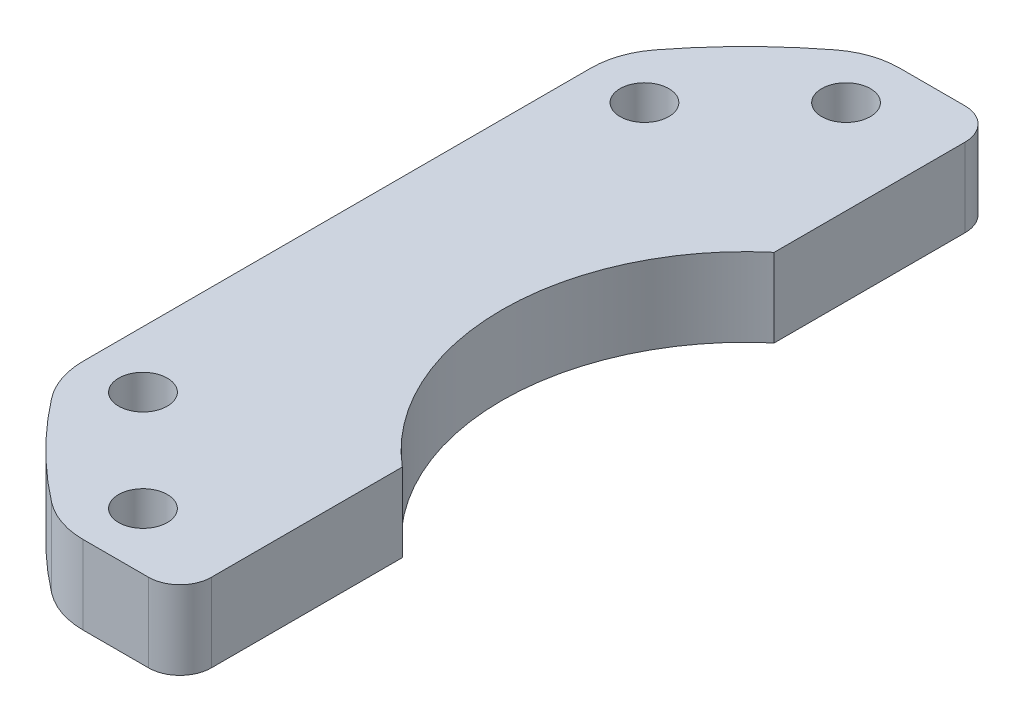
ISO-10303-21;
HEADER;
FILE_DESCRIPTION(('STEP AP214'),'2;1');
FILE_NAME('part.step','',(''),(''),'','','');
FILE_SCHEMA(('AUTOMOTIVE_DESIGN { 1 0 10303 214 1 1 1 1 }'));
ENDSEC;
DATA;
#1=APPLICATION_CONTEXT('core data for automotive mechanical design processes');
#2=APPLICATION_PROTOCOL_DEFINITION('international standard','automotive_design',2000,#1);
#3=PRODUCT_CONTEXT('',#1,'mechanical');
#4=PRODUCT('Part','Part','',(#3));
#5=PRODUCT_RELATED_PRODUCT_CATEGORY('part','',(#4));
#6=PRODUCT_DEFINITION_FORMATION('','',#4);
#7=PRODUCT_DEFINITION_CONTEXT('part definition',#1,'design');
#8=PRODUCT_DEFINITION('design','',#6,#7);
#9=PRODUCT_DEFINITION_SHAPE('','',#8);
#10=(LENGTH_UNIT() NAMED_UNIT(*) SI_UNIT(.MILLI.,.METRE.));
#11=(NAMED_UNIT(*) PLANE_ANGLE_UNIT() SI_UNIT($,.RADIAN.));
#12=(NAMED_UNIT(*) SI_UNIT($,.STERADIAN.) SOLID_ANGLE_UNIT());
#13=UNCERTAINTY_MEASURE_WITH_UNIT(LENGTH_MEASURE(1.E-05),#10,'distance_accuracy_value','');
#14=(GEOMETRIC_REPRESENTATION_CONTEXT(3) GLOBAL_UNCERTAINTY_ASSIGNED_CONTEXT((#13)) GLOBAL_UNIT_ASSIGNED_CONTEXT((#10,
#11,#12)) REPRESENTATION_CONTEXT('',''));
#15=CARTESIAN_POINT('',(0.,0.,0.));
#16=DIRECTION('',(0.,0.,1.));
#17=DIRECTION('',(1.,0.,0.));
#18=AXIS2_PLACEMENT_3D('',#15,#16,#17);
#19=CARTESIAN_POINT('',(0.,5.,0.));
#20=DIRECTION('',(0.,1.,0.));
#21=DIRECTION('',(0.,0.,1.));
#22=AXIS2_PLACEMENT_3D('',#19,#20,#21);
#23=PLANE('',#22);
#24=CARTESIAN_POINT('',(0.,5.,0.));
#25=DIRECTION('',(0.,1.,0.));
#26=DIRECTION('',(0.,0.,1.));
#27=AXIS2_PLACEMENT_3D('',#24,#25,#26);
#28=CIRCLE('',#27,31.5);
#29=CARTESIAN_POINT('',(-24.9622641509436,5.,19.2128958894415));
#30=VERTEX_POINT('',#29);
#31=CARTESIAN_POINT('',(-19.2128958894419,5.,24.9622641509433));
#32=VERTEX_POINT('',#31);
#33=EDGE_CURVE('E186',#30,#32,#28,.T.);
#34=ORIENTED_EDGE('',*,*,#33,.T.);
#35=CARTESIAN_POINT('',(-16.1632298752448,5.,20.9999999999999));
#36=DIRECTION('',(0.,1.,0.));
#37=DIRECTION('',(0.,0.,1.));
#38=AXIS2_PLACEMENT_3D('',#35,#36,#37);
#39=CIRCLE('',#38,5.);
#40=CARTESIAN_POINT('',(-16.1632298752448,5.,25.9999999999999));
#41=VERTEX_POINT('',#40);
#42=EDGE_CURVE('E240',#32,#41,#39,.T.);
#43=ORIENTED_EDGE('',*,*,#42,.T.);
#44=DIRECTION('',(1.,0.,0.));
#45=VECTOR('',#44,1.);
#46=CARTESIAN_POINT('',(17.7834192437786,5.,26.0000000000001));
#47=LINE('',#46,#45);
#48=CARTESIAN_POINT('',(-12.,5.,25.9999999999999));
#49=VERTEX_POINT('',#48);
#50=EDGE_CURVE('E188',#41,#49,#47,.T.);
#51=ORIENTED_EDGE('',*,*,#50,.T.);
#52=CARTESIAN_POINT('',(-12.,5.,23.9999999999999));
#53=DIRECTION('',(0.,1.,0.));
#54=DIRECTION('',(0.,0.,1.));
#55=AXIS2_PLACEMENT_3D('',#52,#53,#54);
#56=CIRCLE('',#55,2.);
#57=CARTESIAN_POINT('',(-9.99999999999999,5.,23.9999999999999));
#58=VERTEX_POINT('',#57);
#59=EDGE_CURVE('E163',#49,#58,#56,.T.);
#60=ORIENTED_EDGE('',*,*,#59,.T.);
#61=DIRECTION('',(0.,0.,1.));
#62=VECTOR('',#61,1.);
#63=CARTESIAN_POINT('',(-10.,5.,-41.4188248679399));
#64=LINE('',#63,#62);
#65=CARTESIAN_POINT('',(-9.99999999999999,5.,11.842719282327));
#66=VERTEX_POINT('',#65);
#67=EDGE_CURVE('E146',#66,#58,#64,.T.);
#68=ORIENTED_EDGE('',*,*,#67,.F.);
#69=CARTESIAN_POINT('',(0.,5.,0.));
#70=DIRECTION('',(0.,1.,0.));
#71=DIRECTION('',(0.,0.,1.));
#72=AXIS2_PLACEMENT_3D('',#69,#70,#71);
#73=CIRCLE('',#72,15.5);
#74=CARTESIAN_POINT('',(-9.99999999999999,5.,-11.842719282327));
#75=VERTEX_POINT('',#74);
#76=EDGE_CURVE('E161',#75,#66,#73,.T.);
#77=ORIENTED_EDGE('',*,*,#76,.F.);
#78=CARTESIAN_POINT('',(-10.,5.,-24.));
#79=VERTEX_POINT('',#78);
#80=EDGE_CURVE('E164',#79,#75,#64,.T.);
#81=ORIENTED_EDGE('',*,*,#80,.F.);
#82=CARTESIAN_POINT('',(-12.,5.,-24.));
#83=DIRECTION('',(0.,1.,0.));
#84=DIRECTION('',(0.,0.,1.));
#85=AXIS2_PLACEMENT_3D('',#82,#83,#84);
#86=CIRCLE('',#85,2.);
#87=CARTESIAN_POINT('',(-12.,5.,-26.));
#88=VERTEX_POINT('',#87);
#89=EDGE_CURVE('E204',#79,#88,#86,.T.);
#90=ORIENTED_EDGE('',*,*,#89,.T.);
#91=DIRECTION('',(-1.,0.,0.));
#92=VECTOR('',#91,1.);
#93=CARTESIAN_POINT('',(-17.7834192437787,5.,-26.));
#94=LINE('',#93,#92);
#95=CARTESIAN_POINT('',(-16.1632298752446,5.,-26.));
#96=VERTEX_POINT('',#95);
#97=EDGE_CURVE('E155',#88,#96,#94,.T.);
#98=ORIENTED_EDGE('',*,*,#97,.T.);
#99=CARTESIAN_POINT('',(-16.1632298752446,5.,-21.));
#100=DIRECTION('',(0.,1.,0.));
#101=DIRECTION('',(0.,0.,1.));
#102=AXIS2_PLACEMENT_3D('',#99,#100,#101);
#103=CIRCLE('',#102,5.);
#104=CARTESIAN_POINT('',(-19.2128958894417,5.,-24.9622641509434));
#105=VERTEX_POINT('',#104);
#106=EDGE_CURVE('E235',#96,#105,#103,.T.);
#107=ORIENTED_EDGE('',*,*,#106,.T.);
#108=CARTESIAN_POINT('',(0.,5.,0.));
#109=DIRECTION('',(0.,1.,0.));
#110=DIRECTION('',(0.,0.,1.));
#111=AXIS2_PLACEMENT_3D('',#108,#109,#110);
#112=CIRCLE('',#111,31.5);
#113=CARTESIAN_POINT('',(-24.9622641509432,5.,-19.212895889442));
#114=VERTEX_POINT('',#113);
#115=EDGE_CURVE('E181',#105,#114,#112,.T.);
#116=ORIENTED_EDGE('',*,*,#115,.T.);
#117=CARTESIAN_POINT('',(-20.9999999999998,5.,-16.1632298752448));
#118=DIRECTION('',(0.,1.,0.));
#119=DIRECTION('',(0.,0.,1.));
#120=AXIS2_PLACEMENT_3D('',#117,#118,#119);
#121=CIRCLE('',#120,5.);
#122=CARTESIAN_POINT('',(-25.9999999999998,5.,-16.1632298752449));
#123=VERTEX_POINT('',#122);
#124=EDGE_CURVE('E63',#114,#123,#121,.T.);
#125=ORIENTED_EDGE('',*,*,#124,.T.);
#126=DIRECTION('',(0.,0.,1.));
#127=VECTOR('',#126,1.);
#128=CARTESIAN_POINT('',(-26.0000000000002,5.,17.7834192437785));
#129=LINE('',#128,#127);
#130=CARTESIAN_POINT('',(-26.0000000000002,5.,16.1632298752443));
#131=VERTEX_POINT('',#130);
#132=EDGE_CURVE('E183',#123,#131,#129,.T.);
#133=ORIENTED_EDGE('',*,*,#132,.T.);
#134=CARTESIAN_POINT('',(-21.0000000000002,5.,16.1632298752444));
#135=DIRECTION('',(0.,1.,0.));
#136=DIRECTION('',(0.,0.,1.));
#137=AXIS2_PLACEMENT_3D('',#134,#135,#136);
#138=CIRCLE('',#137,5.);
#139=EDGE_CURVE('E238',#131,#30,#138,.T.);
#140=ORIENTED_EDGE('',*,*,#139,.T.);
#141=EDGE_LOOP('',(#34,#43,#51,#60,#68,#77,#81,#90,#98,#107,#116,#125,#133,#140));
#142=FACE_BOUND('',#141,.T.);
#143=CARTESIAN_POINT('',(-22.3881767547989,5.,15.9693312820507));
#144=DIRECTION('',(0.,1.,0.));
#145=DIRECTION('',(0.,0.,-1.));
#146=AXIS2_PLACEMENT_3D('',#143,#144,#145);
#147=CIRCLE('',#146,1.55);
#148=CARTESIAN_POINT('',(-22.3881767547989,5.,14.4193312820507));
#149=VERTEX_POINT('',#148);
#150=EDGE_CURVE('E466',#149,#149,#147,.T.);
#151=ORIENTED_EDGE('',*,*,#150,.F.);
#152=EDGE_LOOP('',(#151));
#153=FACE_BOUND('',#152,.T.);
#154=CARTESIAN_POINT('',(-22.3881767547989,5.,-15.9693312820507));
#155=DIRECTION('',(0.,1.,0.));
#156=DIRECTION('',(0.,0.,1.));
#157=AXIS2_PLACEMENT_3D('',#154,#155,#156);
#158=CIRCLE('',#157,1.55);
#159=CARTESIAN_POINT('',(-22.3881767547989,5.,-14.4193312820507));
#160=VERTEX_POINT('',#159);
#161=EDGE_CURVE('E175',#160,#160,#158,.T.);
#162=ORIENTED_EDGE('',*,*,#161,.F.);
#163=EDGE_LOOP('',(#162));
#164=FACE_BOUND('',#163,.T.);
#165=CARTESIAN_POINT('',(-15.969331282051,5.,-22.3881767547987));
#166=DIRECTION('',(0.,1.,0.));
#167=DIRECTION('',(0.,0.,-1.));
#168=AXIS2_PLACEMENT_3D('',#165,#166,#167);
#169=CIRCLE('',#168,1.55);
#170=CARTESIAN_POINT('',(-15.969331282051,5.,-23.9381767547987));
#171=VERTEX_POINT('',#170);
#172=EDGE_CURVE('E460',#171,#171,#169,.T.);
#173=ORIENTED_EDGE('',*,*,#172,.F.);
#174=EDGE_LOOP('',(#173));
#175=FACE_BOUND('',#174,.T.);
#176=CARTESIAN_POINT('',(-15.969331282051,5.,22.3881767547987));
#177=DIRECTION('',(0.,1.,0.));
#178=DIRECTION('',(0.,0.,1.));
#179=AXIS2_PLACEMENT_3D('',#176,#177,#178);
#180=CIRCLE('',#179,1.55);
#181=CARTESIAN_POINT('',(-15.969331282051,5.,23.9381767547987));
#182=VERTEX_POINT('',#181);
#183=EDGE_CURVE('E472',#182,#182,#180,.T.);
#184=ORIENTED_EDGE('',*,*,#183,.F.);
#185=EDGE_LOOP('',(#184));
#186=FACE_BOUND('',#185,.T.);
#187=ADVANCED_FACE('F41',(#142,#153,#164,#175,#186),#23,.T.);
#188=CARTESIAN_POINT('',(0.,0.,0.));
#189=DIRECTION('',(0.,1.,0.));
#190=DIRECTION('',(0.,0.,1.));
#191=AXIS2_PLACEMENT_3D('',#188,#189,#190);
#192=PLANE('',#191);
#193=DIRECTION('',(1.,0.,0.));
#194=VECTOR('',#193,1.);
#195=CARTESIAN_POINT('',(17.7834192437786,0.,26.0000000000001));
#196=LINE('',#195,#194);
#197=CARTESIAN_POINT('',(-16.1632298752448,0.,25.9999999999999));
#198=VERTEX_POINT('',#197);
#199=CARTESIAN_POINT('',(-12.,0.,25.9999999999999));
#200=VERTEX_POINT('',#199);
#201=EDGE_CURVE('E196',#198,#200,#196,.T.);
#202=ORIENTED_EDGE('',*,*,#201,.F.);
#203=CARTESIAN_POINT('',(-16.1632298752448,0.,20.9999999999999));
#204=DIRECTION('',(0.,1.,0.));
#205=DIRECTION('',(0.,0.,1.));
#206=AXIS2_PLACEMENT_3D('',#203,#204,#205);
#207=CIRCLE('',#206,5.);
#208=CARTESIAN_POINT('',(-19.2128958894419,0.,24.9622641509433));
#209=VERTEX_POINT('',#208);
#210=EDGE_CURVE('E228',#198,#209,#207,.F.);
#211=ORIENTED_EDGE('',*,*,#210,.T.);
#212=CARTESIAN_POINT('',(0.,0.,0.));
#213=DIRECTION('',(0.,1.,0.));
#214=DIRECTION('',(0.,0.,1.));
#215=AXIS2_PLACEMENT_3D('',#212,#213,#214);
#216=CIRCLE('',#215,31.5);
#217=CARTESIAN_POINT('',(-24.9622641509436,0.,19.2128958894415));
#218=VERTEX_POINT('',#217);
#219=EDGE_CURVE('E193',#218,#209,#216,.T.);
#220=ORIENTED_EDGE('',*,*,#219,.F.);
#221=CARTESIAN_POINT('',(-21.0000000000002,0.,16.1632298752444));
#222=DIRECTION('',(0.,1.,0.));
#223=DIRECTION('',(0.,0.,1.));
#224=AXIS2_PLACEMENT_3D('',#221,#222,#223);
#225=CIRCLE('',#224,5.);
#226=CARTESIAN_POINT('',(-26.0000000000002,0.,16.1632298752443));
#227=VERTEX_POINT('',#226);
#228=EDGE_CURVE('E226',#218,#227,#225,.F.);
#229=ORIENTED_EDGE('',*,*,#228,.T.);
#230=DIRECTION('',(0.,0.,1.));
#231=VECTOR('',#230,1.);
#232=CARTESIAN_POINT('',(-26.0000000000002,0.,17.7834192437785));
#233=LINE('',#232,#231);
#234=CARTESIAN_POINT('',(-25.9999999999998,0.,-16.1632298752449));
#235=VERTEX_POINT('',#234);
#236=EDGE_CURVE('E173',#235,#227,#233,.T.);
#237=ORIENTED_EDGE('',*,*,#236,.F.);
#238=CARTESIAN_POINT('',(-20.9999999999998,0.,-16.1632298752448));
#239=DIRECTION('',(0.,1.,0.));
#240=DIRECTION('',(0.,0.,1.));
#241=AXIS2_PLACEMENT_3D('',#238,#239,#240);
#242=CIRCLE('',#241,5.);
#243=CARTESIAN_POINT('',(-24.9622641509432,0.,-19.212895889442));
#244=VERTEX_POINT('',#243);
#245=EDGE_CURVE('E224',#235,#244,#242,.F.);
#246=ORIENTED_EDGE('',*,*,#245,.T.);
#247=CARTESIAN_POINT('',(0.,0.,0.));
#248=DIRECTION('',(0.,1.,0.));
#249=DIRECTION('',(0.,0.,1.));
#250=AXIS2_PLACEMENT_3D('',#247,#248,#249);
#251=CIRCLE('',#250,31.5);
#252=CARTESIAN_POINT('',(-19.2128958894417,0.,-24.9622641509434));
#253=VERTEX_POINT('',#252);
#254=EDGE_CURVE('E169',#253,#244,#251,.T.);
#255=ORIENTED_EDGE('',*,*,#254,.F.);
#256=CARTESIAN_POINT('',(-16.1632298752446,0.,-21.));
#257=DIRECTION('',(0.,1.,0.));
#258=DIRECTION('',(0.,0.,1.));
#259=AXIS2_PLACEMENT_3D('',#256,#257,#258);
#260=CIRCLE('',#259,5.);
#261=CARTESIAN_POINT('',(-16.1632298752446,0.,-26.));
#262=VERTEX_POINT('',#261);
#263=EDGE_CURVE('E222',#253,#262,#260,.F.);
#264=ORIENTED_EDGE('',*,*,#263,.T.);
#265=DIRECTION('',(-1.,0.,0.));
#266=VECTOR('',#265,1.);
#267=CARTESIAN_POINT('',(-17.7834192437787,0.,-26.));
#268=LINE('',#267,#266);
#269=CARTESIAN_POINT('',(-12.,0.,-26.));
#270=VERTEX_POINT('',#269);
#271=EDGE_CURVE('E184',#270,#262,#268,.T.);
#272=ORIENTED_EDGE('',*,*,#271,.F.);
#273=CARTESIAN_POINT('',(-12.,0.,-24.));
#274=DIRECTION('',(0.,1.,0.));
#275=DIRECTION('',(0.,0.,1.));
#276=AXIS2_PLACEMENT_3D('',#273,#274,#275);
#277=CIRCLE('',#276,2.);
#278=CARTESIAN_POINT('',(-10.,0.,-24.));
#279=VERTEX_POINT('',#278);
#280=EDGE_CURVE('E209',#270,#279,#277,.F.);
#281=ORIENTED_EDGE('',*,*,#280,.T.);
#282=DIRECTION('',(0.,0.,1.));
#283=VECTOR('',#282,1.);
#284=CARTESIAN_POINT('',(-9.99999999999999,0.,0.));
#285=LINE('',#284,#283);
#286=CARTESIAN_POINT('',(-10.,0.,-11.842719282327));
#287=VERTEX_POINT('',#286);
#288=EDGE_CURVE('E478',#279,#287,#285,.T.);
#289=ORIENTED_EDGE('',*,*,#288,.T.);
#290=CARTESIAN_POINT('',(0.,0.,0.));
#291=DIRECTION('',(0.,1.,0.));
#292=DIRECTION('',(0.,0.,1.));
#293=AXIS2_PLACEMENT_3D('',#290,#291,#292);
#294=CIRCLE('',#293,15.5);
#295=CARTESIAN_POINT('',(-9.99999999999999,0.,11.842719282327));
#296=VERTEX_POINT('',#295);
#297=EDGE_CURVE('E170',#287,#296,#294,.T.);
#298=ORIENTED_EDGE('',*,*,#297,.T.);
#299=CARTESIAN_POINT('',(-9.99999999999999,0.,23.9999999999999));
#300=VERTEX_POINT('',#299);
#301=EDGE_CURVE('E149',#296,#300,#285,.T.);
#302=ORIENTED_EDGE('',*,*,#301,.T.);
#303=CARTESIAN_POINT('',(-12.,0.,23.9999999999999));
#304=DIRECTION('',(0.,1.,0.));
#305=DIRECTION('',(0.,0.,1.));
#306=AXIS2_PLACEMENT_3D('',#303,#304,#305);
#307=CIRCLE('',#306,2.);
#308=EDGE_CURVE('E211',#300,#200,#307,.F.);
#309=ORIENTED_EDGE('',*,*,#308,.T.);
#310=EDGE_LOOP('',(#202,#211,#220,#229,#237,#246,#255,#264,#272,#281,#289,#298,#302,#309));
#311=FACE_BOUND('',#310,.T.);
#312=CARTESIAN_POINT('',(-22.3881767547989,0.,-15.9693312820507));
#313=DIRECTION('',(0.,1.,0.));
#314=DIRECTION('',(0.,0.,1.));
#315=AXIS2_PLACEMENT_3D('',#312,#313,#314);
#316=CIRCLE('',#315,1.55);
#317=CARTESIAN_POINT('',(-22.3881767547989,0.,-14.4193312820507));
#318=VERTEX_POINT('',#317);
#319=EDGE_CURVE('E178',#318,#318,#316,.T.);
#320=ORIENTED_EDGE('',*,*,#319,.T.);
#321=EDGE_LOOP('',(#320));
#322=FACE_BOUND('',#321,.T.);
#323=CARTESIAN_POINT('',(-15.969331282051,0.,-22.3881767547987));
#324=DIRECTION('',(0.,1.,0.));
#325=DIRECTION('',(0.,0.,-1.));
#326=AXIS2_PLACEMENT_3D('',#323,#324,#325);
#327=CIRCLE('',#326,1.55);
#328=CARTESIAN_POINT('',(-15.969331282051,0.,-23.9381767547987));
#329=VERTEX_POINT('',#328);
#330=EDGE_CURVE('E462',#329,#329,#327,.T.);
#331=ORIENTED_EDGE('',*,*,#330,.T.);
#332=EDGE_LOOP('',(#331));
#333=FACE_BOUND('',#332,.T.);
#334=CARTESIAN_POINT('',(-22.3881767547989,0.,15.9693312820507));
#335=DIRECTION('',(0.,1.,0.));
#336=DIRECTION('',(0.,0.,-1.));
#337=AXIS2_PLACEMENT_3D('',#334,#335,#336);
#338=CIRCLE('',#337,1.55);
#339=CARTESIAN_POINT('',(-22.3881767547989,0.,14.4193312820507));
#340=VERTEX_POINT('',#339);
#341=EDGE_CURVE('E469',#340,#340,#338,.T.);
#342=ORIENTED_EDGE('',*,*,#341,.T.);
#343=EDGE_LOOP('',(#342));
#344=FACE_BOUND('',#343,.T.);
#345=CARTESIAN_POINT('',(-15.969331282051,0.,22.3881767547987));
#346=DIRECTION('',(0.,1.,0.));
#347=DIRECTION('',(0.,0.,1.));
#348=AXIS2_PLACEMENT_3D('',#345,#346,#347);
#349=CIRCLE('',#348,1.55);
#350=CARTESIAN_POINT('',(-15.969331282051,0.,23.9381767547987));
#351=VERTEX_POINT('',#350);
#352=EDGE_CURVE('E475',#351,#351,#349,.T.);
#353=ORIENTED_EDGE('',*,*,#352,.T.);
#354=EDGE_LOOP('',(#353));
#355=FACE_BOUND('',#354,.T.);
#356=ADVANCED_FACE('F262',(#311,#322,#333,#344,#355),#192,.F.);
#357=CARTESIAN_POINT('',(0.,5.,0.));
#358=DIRECTION('',(0.,-1.,0.));
#359=DIRECTION('',(0.,0.,-1.));
#360=AXIS2_PLACEMENT_3D('',#357,#358,#359);
#361=CYLINDRICAL_SURFACE('',#360,31.5);
#362=ORIENTED_EDGE('',*,*,#254,.T.);
#363=DIRECTION('',(0.,-1.,0.));
#364=VECTOR('',#363,1.);
#365=CARTESIAN_POINT('',(-24.9622641509432,5.,-19.212895889442));
#366=LINE('',#365,#364);
#367=EDGE_CURVE('E49',#244,#114,#366,.F.);
#368=ORIENTED_EDGE('',*,*,#367,.T.);
#369=ORIENTED_EDGE('',*,*,#115,.F.);
#370=DIRECTION('',(0.,-1.,0.));
#371=VECTOR('',#370,1.);
#372=CARTESIAN_POINT('',(-19.2128958894417,5.,-24.9622641509434));
#373=LINE('',#372,#371);
#374=EDGE_CURVE('E246',#105,#253,#373,.T.);
#375=ORIENTED_EDGE('',*,*,#374,.T.);
#376=EDGE_LOOP('',(#362,#368,#369,#375));
#377=FACE_BOUND('',#376,.T.);
#378=ADVANCED_FACE('F251',(#377),#361,.T.);
#379=CARTESIAN_POINT('',(-26.0000000000002,5.,17.7834192437785));
#380=DIRECTION('',(1.,0.,0.));
#381=DIRECTION('',(0.,0.,-1.));
#382=AXIS2_PLACEMENT_3D('',#379,#380,#381);
#383=PLANE('',#382);
#384=ORIENTED_EDGE('',*,*,#236,.T.);
#385=DIRECTION('',(0.,-1.,0.));
#386=VECTOR('',#385,1.);
#387=CARTESIAN_POINT('',(-26.0000000000002,5.,16.1632298752443));
#388=LINE('',#387,#386);
#389=EDGE_CURVE('E56',#227,#131,#388,.F.);
#390=ORIENTED_EDGE('',*,*,#389,.T.);
#391=ORIENTED_EDGE('',*,*,#132,.F.);
#392=DIRECTION('',(0.,-1.,0.));
#393=VECTOR('',#392,1.);
#394=CARTESIAN_POINT('',(-25.9999999999998,5.,-16.1632298752449));
#395=LINE('',#394,#393);
#396=EDGE_CURVE('E242',#123,#235,#395,.T.);
#397=ORIENTED_EDGE('',*,*,#396,.T.);
#398=EDGE_LOOP('',(#384,#390,#391,#397));
#399=FACE_BOUND('',#398,.T.);
#400=ADVANCED_FACE('F259',(#399),#383,.F.);
#401=CARTESIAN_POINT('',(0.,5.,0.));
#402=DIRECTION('',(0.,-1.,0.));
#403=DIRECTION('',(0.,0.,-1.));
#404=AXIS2_PLACEMENT_3D('',#401,#402,#403);
#405=CYLINDRICAL_SURFACE('',#404,31.5);
#406=ORIENTED_EDGE('',*,*,#219,.T.);
#407=DIRECTION('',(0.,-1.,0.));
#408=VECTOR('',#407,1.);
#409=CARTESIAN_POINT('',(-19.2128958894419,5.,24.9622641509433));
#410=LINE('',#409,#408);
#411=EDGE_CURVE('E233',#209,#32,#410,.F.);
#412=ORIENTED_EDGE('',*,*,#411,.T.);
#413=ORIENTED_EDGE('',*,*,#33,.F.);
#414=DIRECTION('',(0.,-1.,0.));
#415=VECTOR('',#414,1.);
#416=CARTESIAN_POINT('',(-24.9622641509436,5.,19.2128958894415));
#417=LINE('',#416,#415);
#418=EDGE_CURVE('E230',#30,#218,#417,.T.);
#419=ORIENTED_EDGE('',*,*,#418,.T.);
#420=EDGE_LOOP('',(#406,#412,#413,#419));
#421=FACE_BOUND('',#420,.T.);
#422=ADVANCED_FACE('F271',(#421),#405,.T.);
#423=CARTESIAN_POINT('',(17.7834192437786,5.,26.0000000000001));
#424=DIRECTION('',(0.,0.,-1.));
#425=DIRECTION('',(-1.,0.,0.));
#426=AXIS2_PLACEMENT_3D('',#423,#424,#425);
#427=PLANE('',#426);
#428=ORIENTED_EDGE('',*,*,#50,.F.);
#429=DIRECTION('',(0.,-1.,0.));
#430=VECTOR('',#429,1.);
#431=CARTESIAN_POINT('',(-16.1632298752448,5.,25.9999999999999));
#432=LINE('',#431,#430);
#433=EDGE_CURVE('E219',#41,#198,#432,.T.);
#434=ORIENTED_EDGE('',*,*,#433,.T.);
#435=ORIENTED_EDGE('',*,*,#201,.T.);
#436=DIRECTION('',(0.,1.,0.));
#437=VECTOR('',#436,1.);
#438=CARTESIAN_POINT('',(-12.,5.,25.9999999999999));
#439=LINE('',#438,#437);
#440=EDGE_CURVE('E201',#200,#49,#439,.T.);
#441=ORIENTED_EDGE('',*,*,#440,.T.);
#442=EDGE_LOOP('',(#428,#434,#435,#441));
#443=FACE_BOUND('',#442,.T.);
#444=ADVANCED_FACE('F279',(#443),#427,.F.);
#445=CARTESIAN_POINT('',(-17.7834192437787,5.,-26.));
#446=DIRECTION('',(0.,0.,1.));
#447=DIRECTION('',(1.,0.,0.));
#448=AXIS2_PLACEMENT_3D('',#445,#446,#447);
#449=PLANE('',#448);
#450=ORIENTED_EDGE('',*,*,#271,.T.);
#451=DIRECTION('',(0.,-1.,0.));
#452=VECTOR('',#451,1.);
#453=CARTESIAN_POINT('',(-16.1632298752446,5.,-26.));
#454=LINE('',#453,#452);
#455=EDGE_CURVE('E11',#262,#96,#454,.F.);
#456=ORIENTED_EDGE('',*,*,#455,.T.);
#457=ORIENTED_EDGE('',*,*,#97,.F.);
#458=DIRECTION('',(0.,-1.,0.));
#459=VECTOR('',#458,1.);
#460=CARTESIAN_POINT('',(-12.,5.,-26.));
#461=LINE('',#460,#459);
#462=EDGE_CURVE('E214',#88,#270,#461,.T.);
#463=ORIENTED_EDGE('',*,*,#462,.T.);
#464=EDGE_LOOP('',(#450,#456,#457,#463));
#465=FACE_BOUND('',#464,.T.);
#466=ADVANCED_FACE('F306',(#465),#449,.F.);
#467=CARTESIAN_POINT('',(0.,5.,0.));
#468=DIRECTION('',(0.,-1.,0.));
#469=DIRECTION('',(0.,0.,-1.));
#470=AXIS2_PLACEMENT_3D('',#467,#468,#469);
#471=CYLINDRICAL_SURFACE('',#470,15.5);
#472=DIRECTION('',(0.,-1.,0.));
#473=VECTOR('',#472,1.);
#474=CARTESIAN_POINT('',(-10.,5.,-11.842719282327));
#475=LINE('',#474,#473);
#476=EDGE_CURVE('E154',#75,#287,#475,.T.);
#477=ORIENTED_EDGE('',*,*,#476,.F.);
#478=ORIENTED_EDGE('',*,*,#76,.T.);
#479=DIRECTION('',(0.,-1.,0.));
#480=VECTOR('',#479,1.);
#481=CARTESIAN_POINT('',(-9.99999999999999,5.,11.842719282327));
#482=LINE('',#481,#480);
#483=EDGE_CURVE('E143',#296,#66,#482,.F.);
#484=ORIENTED_EDGE('',*,*,#483,.F.);
#485=ORIENTED_EDGE('',*,*,#297,.F.);
#486=EDGE_LOOP('',(#477,#478,#484,#485));
#487=FACE_BOUND('',#486,.T.);
#488=ADVANCED_FACE('F167',(#487),#471,.F.);
#489=CARTESIAN_POINT('',(-22.3881767547989,5.,-15.9693312820507));
#490=DIRECTION('',(0.,-1.,0.));
#491=DIRECTION('',(0.,0.,-1.));
#492=AXIS2_PLACEMENT_3D('',#489,#490,#491);
#493=CYLINDRICAL_SURFACE('',#492,1.55);
#494=ORIENTED_EDGE('',*,*,#161,.T.);
#495=EDGE_LOOP('',(#494));
#496=FACE_BOUND('',#495,.T.);
#497=ORIENTED_EDGE('',*,*,#319,.F.);
#498=EDGE_LOOP('',(#497));
#499=FACE_BOUND('',#498,.T.);
#500=ADVANCED_FACE('F419',(#496,#499),#493,.F.);
#501=CARTESIAN_POINT('',(-15.969331282051,5.,-22.3881767547987));
#502=DIRECTION('',(0.,-1.,0.));
#503=DIRECTION('',(0.,0.,-1.));
#504=AXIS2_PLACEMENT_3D('',#501,#502,#503);
#505=CYLINDRICAL_SURFACE('',#504,1.55);
#506=ORIENTED_EDGE('',*,*,#172,.T.);
#507=EDGE_LOOP('',(#506));
#508=FACE_BOUND('',#507,.T.);
#509=ORIENTED_EDGE('',*,*,#330,.F.);
#510=EDGE_LOOP('',(#509));
#511=FACE_BOUND('',#510,.T.);
#512=ADVANCED_FACE('F410',(#508,#511),#505,.F.);
#513=CARTESIAN_POINT('',(-22.3881767547989,5.,15.9693312820507));
#514=DIRECTION('',(0.,-1.,0.));
#515=DIRECTION('',(0.,0.,-1.));
#516=AXIS2_PLACEMENT_3D('',#513,#514,#515);
#517=CYLINDRICAL_SURFACE('',#516,1.55);
#518=ORIENTED_EDGE('',*,*,#150,.T.);
#519=EDGE_LOOP('',(#518));
#520=FACE_BOUND('',#519,.T.);
#521=ORIENTED_EDGE('',*,*,#341,.F.);
#522=EDGE_LOOP('',(#521));
#523=FACE_BOUND('',#522,.T.);
#524=ADVANCED_FACE('F401',(#520,#523),#517,.F.);
#525=CARTESIAN_POINT('',(-15.969331282051,5.,22.3881767547987));
#526=DIRECTION('',(0.,-1.,0.));
#527=DIRECTION('',(0.,0.,-1.));
#528=AXIS2_PLACEMENT_3D('',#525,#526,#527);
#529=CYLINDRICAL_SURFACE('',#528,1.55);
#530=ORIENTED_EDGE('',*,*,#183,.T.);
#531=EDGE_LOOP('',(#530));
#532=FACE_BOUND('',#531,.T.);
#533=ORIENTED_EDGE('',*,*,#352,.F.);
#534=EDGE_LOOP('',(#533));
#535=FACE_BOUND('',#534,.T.);
#536=ADVANCED_FACE('F394',(#532,#535),#529,.F.);
#537=CARTESIAN_POINT('',(-10.,-5.,-41.4188248679399));
#538=DIRECTION('',(-1.,0.,0.));
#539=DIRECTION('',(0.,0.,1.));
#540=AXIS2_PLACEMENT_3D('',#537,#538,#539);
#541=PLANE('',#540);
#542=ORIENTED_EDGE('',*,*,#67,.T.);
#543=DIRECTION('',(0.,1.,0.));
#544=VECTOR('',#543,1.);
#545=CARTESIAN_POINT('',(-9.99999999999999,-5.,23.9999999999999));
#546=LINE('',#545,#544);
#547=EDGE_CURVE('E207',#58,#300,#546,.F.);
#548=ORIENTED_EDGE('',*,*,#547,.T.);
#549=ORIENTED_EDGE('',*,*,#301,.F.);
#550=ORIENTED_EDGE('',*,*,#483,.T.);
#551=EDGE_LOOP('',(#542,#548,#549,#550));
#552=FACE_BOUND('',#551,.T.);
#553=ADVANCED_FACE('F145',(#552),#541,.F.);
#554=ORIENTED_EDGE('',*,*,#288,.F.);
#555=DIRECTION('',(0.,-1.,0.));
#556=VECTOR('',#555,1.);
#557=CARTESIAN_POINT('',(-10.,-5.,-24.));
#558=LINE('',#557,#556);
#559=EDGE_CURVE('E217',#279,#79,#558,.F.);
#560=ORIENTED_EDGE('',*,*,#559,.T.);
#561=ORIENTED_EDGE('',*,*,#80,.T.);
#562=ORIENTED_EDGE('',*,*,#476,.T.);
#563=EDGE_LOOP('',(#554,#560,#561,#562));
#564=FACE_BOUND('',#563,.T.);
#565=ADVANCED_FACE('F286',(#564),#541,.F.);
#566=CARTESIAN_POINT('',(-12.,5.,23.9999999999999));
#567=DIRECTION('',(0.,1.,0.));
#568=DIRECTION('',(0.,0.,1.));
#569=AXIS2_PLACEMENT_3D('',#566,#567,#568);
#570=CYLINDRICAL_SURFACE('',#569,2.);
#571=ORIENTED_EDGE('',*,*,#308,.F.);
#572=ORIENTED_EDGE('',*,*,#547,.F.);
#573=ORIENTED_EDGE('',*,*,#59,.F.);
#574=ORIENTED_EDGE('',*,*,#440,.F.);
#575=EDGE_LOOP('',(#571,#572,#573,#574));
#576=FACE_BOUND('',#575,.T.);
#577=ADVANCED_FACE('F283',(#576),#570,.T.);
#578=CARTESIAN_POINT('',(-12.,5.,-24.));
#579=DIRECTION('',(0.,-1.,0.));
#580=DIRECTION('',(0.,0.,-1.));
#581=AXIS2_PLACEMENT_3D('',#578,#579,#580);
#582=CYLINDRICAL_SURFACE('',#581,2.);
#583=ORIENTED_EDGE('',*,*,#89,.F.);
#584=ORIENTED_EDGE('',*,*,#559,.F.);
#585=ORIENTED_EDGE('',*,*,#280,.F.);
#586=ORIENTED_EDGE('',*,*,#462,.F.);
#587=EDGE_LOOP('',(#583,#584,#585,#586));
#588=FACE_BOUND('',#587,.T.);
#589=ADVANCED_FACE('F285',(#588),#582,.T.);
#590=CARTESIAN_POINT('',(-16.1632298752448,5.,20.9999999999999));
#591=DIRECTION('',(0.,-1.,0.));
#592=DIRECTION('',(0.,0.,-1.));
#593=AXIS2_PLACEMENT_3D('',#590,#591,#592);
#594=CYLINDRICAL_SURFACE('',#593,5.);
#595=ORIENTED_EDGE('',*,*,#42,.F.);
#596=ORIENTED_EDGE('',*,*,#411,.F.);
#597=ORIENTED_EDGE('',*,*,#210,.F.);
#598=ORIENTED_EDGE('',*,*,#433,.F.);
#599=EDGE_LOOP('',(#595,#596,#597,#598));
#600=FACE_BOUND('',#599,.T.);
#601=ADVANCED_FACE('F277',(#600),#594,.T.);
#602=CARTESIAN_POINT('',(-21.0000000000002,5.,16.1632298752444));
#603=DIRECTION('',(0.,-1.,0.));
#604=DIRECTION('',(0.,0.,-1.));
#605=AXIS2_PLACEMENT_3D('',#602,#603,#604);
#606=CYLINDRICAL_SURFACE('',#605,5.);
#607=ORIENTED_EDGE('',*,*,#139,.F.);
#608=ORIENTED_EDGE('',*,*,#389,.F.);
#609=ORIENTED_EDGE('',*,*,#228,.F.);
#610=ORIENTED_EDGE('',*,*,#418,.F.);
#611=EDGE_LOOP('',(#607,#608,#609,#610));
#612=FACE_BOUND('',#611,.T.);
#613=ADVANCED_FACE('F268',(#612),#606,.T.);
#614=CARTESIAN_POINT('',(-20.9999999999998,5.,-16.1632298752448));
#615=DIRECTION('',(0.,-1.,0.));
#616=DIRECTION('',(0.,0.,-1.));
#617=AXIS2_PLACEMENT_3D('',#614,#615,#616);
#618=CYLINDRICAL_SURFACE('',#617,5.);
#619=ORIENTED_EDGE('',*,*,#124,.F.);
#620=ORIENTED_EDGE('',*,*,#367,.F.);
#621=ORIENTED_EDGE('',*,*,#245,.F.);
#622=ORIENTED_EDGE('',*,*,#396,.F.);
#623=EDGE_LOOP('',(#619,#620,#621,#622));
#624=FACE_BOUND('',#623,.T.);
#625=ADVANCED_FACE('F257',(#624),#618,.T.);
#626=CARTESIAN_POINT('',(-16.1632298752446,5.,-21.));
#627=DIRECTION('',(0.,-1.,0.));
#628=DIRECTION('',(0.,0.,-1.));
#629=AXIS2_PLACEMENT_3D('',#626,#627,#628);
#630=CYLINDRICAL_SURFACE('',#629,5.);
#631=ORIENTED_EDGE('',*,*,#106,.F.);
#632=ORIENTED_EDGE('',*,*,#455,.F.);
#633=ORIENTED_EDGE('',*,*,#263,.F.);
#634=ORIENTED_EDGE('',*,*,#374,.F.);
#635=EDGE_LOOP('',(#631,#632,#633,#634));
#636=FACE_BOUND('',#635,.T.);
#637=ADVANCED_FACE('F43',(#636),#630,.T.);
#638=CLOSED_SHELL('',(#187,#356,#378,#400,#422,#444,#466,#488,#500,#512,#524,#536,#553,#565,
#577,#589,#601,#613,#625,#637));
#639=MANIFOLD_SOLID_BREP('B2',#638);
#640=ADVANCED_BREP_SHAPE_REPRESENTATION('',(#18,#639),#14);
#641=SHAPE_DEFINITION_REPRESENTATION(#9,#640);
ENDSEC;
END-ISO-10303-21;
